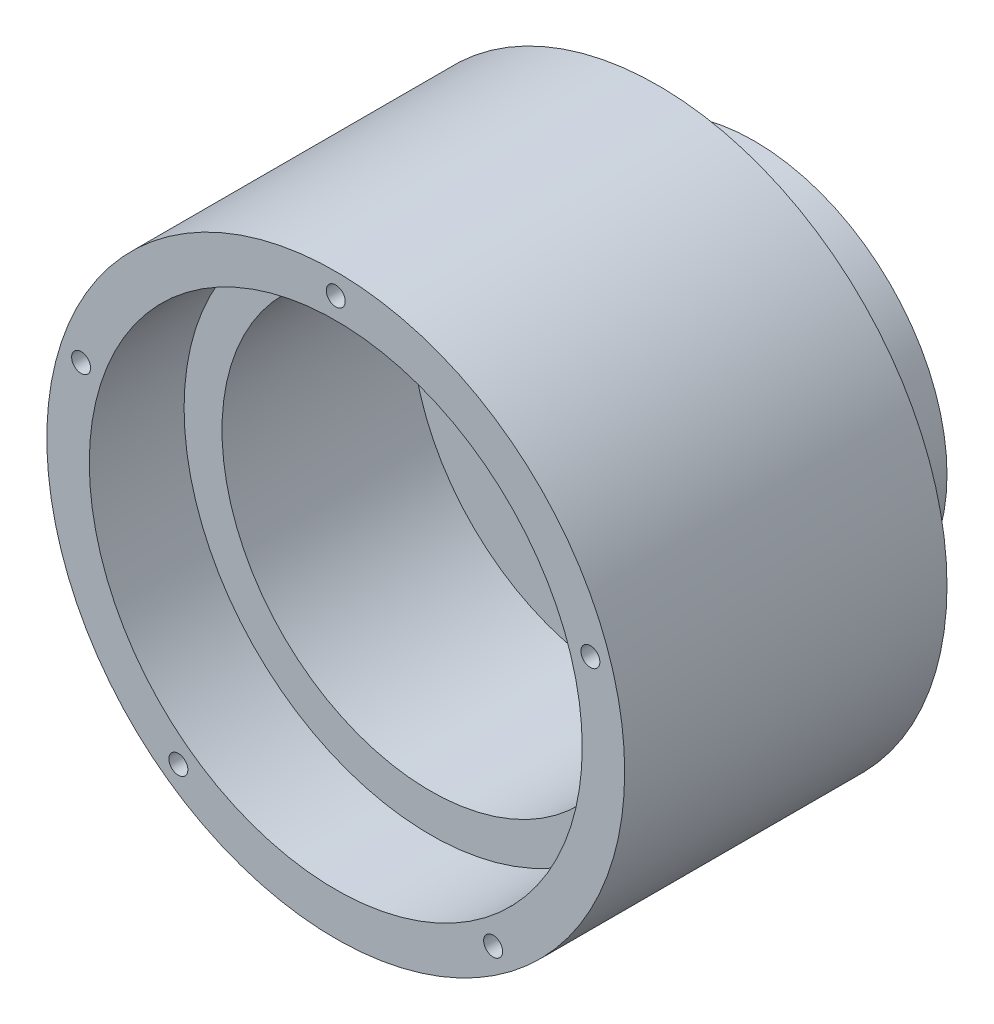
ISO-10303-21;
HEADER;
FILE_DESCRIPTION(('STEP AP214'),'2;1');
FILE_NAME('part.step','',(''),(''),'','','');
FILE_SCHEMA(('AUTOMOTIVE_DESIGN { 1 0 10303 214 1 1 1 1 }'));
ENDSEC;
DATA;
#1=APPLICATION_CONTEXT('core data for automotive mechanical design processes');
#2=APPLICATION_PROTOCOL_DEFINITION('international standard','automotive_design',2000,#1);
#3=PRODUCT_CONTEXT('',#1,'mechanical');
#4=PRODUCT('Part','Part','',(#3));
#5=PRODUCT_RELATED_PRODUCT_CATEGORY('part','',(#4));
#6=PRODUCT_DEFINITION_FORMATION('','',#4);
#7=PRODUCT_DEFINITION_CONTEXT('part definition',#1,'design');
#8=PRODUCT_DEFINITION('design','',#6,#7);
#9=PRODUCT_DEFINITION_SHAPE('','',#8);
#10=(LENGTH_UNIT() NAMED_UNIT(*) SI_UNIT(.MILLI.,.METRE.));
#11=(NAMED_UNIT(*) PLANE_ANGLE_UNIT() SI_UNIT($,.RADIAN.));
#12=(NAMED_UNIT(*) SI_UNIT($,.STERADIAN.) SOLID_ANGLE_UNIT());
#13=UNCERTAINTY_MEASURE_WITH_UNIT(LENGTH_MEASURE(1.E-05),#10,'distance_accuracy_value','');
#14=(GEOMETRIC_REPRESENTATION_CONTEXT(3) GLOBAL_UNCERTAINTY_ASSIGNED_CONTEXT((#13)) GLOBAL_UNIT_ASSIGNED_CONTEXT((#10,
#11,#12)) REPRESENTATION_CONTEXT('',''));
#15=CARTESIAN_POINT('',(0.,0.,0.));
#16=DIRECTION('',(0.,0.,1.));
#17=DIRECTION('',(1.,0.,0.));
#18=AXIS2_PLACEMENT_3D('',#15,#16,#17);
#19=CARTESIAN_POINT('',(0.,0.,85.));
#20=DIRECTION('',(0.,0.,-1.));
#21=DIRECTION('',(-1.,0.,0.));
#22=AXIS2_PLACEMENT_3D('',#19,#20,#21);
#23=CYLINDRICAL_SURFACE('',#22,76.2);
#24=CARTESIAN_POINT('',(0.,0.,85.));
#25=DIRECTION('',(0.,0.,1.));
#26=DIRECTION('',(1.,0.,0.));
#27=AXIS2_PLACEMENT_3D('',#24,#25,#26);
#28=CIRCLE('',#27,76.2);
#29=CARTESIAN_POINT('',(76.2,0.,85.));
#30=VERTEX_POINT('',#29);
#31=EDGE_CURVE('E52',#30,#30,#28,.T.);
#32=ORIENTED_EDGE('',*,*,#31,.F.);
#33=EDGE_LOOP('',(#32));
#34=FACE_BOUND('',#33,.T.);
#35=CARTESIAN_POINT('',(0.,0.,0.));
#36=DIRECTION('',(0.,0.,1.));
#37=DIRECTION('',(1.,0.,0.));
#38=AXIS2_PLACEMENT_3D('',#35,#36,#37);
#39=CIRCLE('',#38,76.2);
#40=CARTESIAN_POINT('',(76.2,0.,0.));
#41=VERTEX_POINT('',#40);
#42=EDGE_CURVE('E57',#41,#41,#39,.T.);
#43=ORIENTED_EDGE('',*,*,#42,.T.);
#44=EDGE_LOOP('',(#43));
#45=FACE_BOUND('',#44,.T.);
#46=ADVANCED_FACE('F45',(#34,#45),#23,.T.);
#47=CARTESIAN_POINT('',(0.,0.,85.));
#48=DIRECTION('',(0.,0.,1.));
#49=DIRECTION('',(1.,0.,0.));
#50=AXIS2_PLACEMENT_3D('',#47,#48,#49);
#51=PLANE('',#50);
#52=CARTESIAN_POINT('',(-67.1560027286335,21.8203080068036,85.));
#53=DIRECTION('',(0.,0.,1.));
#54=DIRECTION('',(0.309016994374945,0.951056516295155,0.));
#55=AXIS2_PLACEMENT_3D('',#52,#53,#54);
#56=CIRCLE('',#55,2.5);
#57=CARTESIAN_POINT('',(-66.3834602426961,24.1979492975415,85.));
#58=VERTEX_POINT('',#57);
#59=EDGE_CURVE('E67',#58,#58,#56,.T.);
#60=ORIENTED_EDGE('',*,*,#59,.F.);
#61=EDGE_LOOP('',(#60));
#62=FACE_BOUND('',#61,.T.);
#63=CARTESIAN_POINT('',(-41.5046922348758,-57.126308006804,85.));
#64=DIRECTION('',(0.,0.,1.));
#65=DIRECTION('',(-0.809016994374951,0.587785252292469,0.));
#66=AXIS2_PLACEMENT_3D('',#63,#64,#65);
#67=CIRCLE('',#66,2.5);
#68=CARTESIAN_POINT('',(-43.5272347208132,-55.6568448760729,85.));
#69=VERTEX_POINT('',#68);
#70=EDGE_CURVE('E73',#69,#69,#67,.T.);
#71=ORIENTED_EDGE('',*,*,#70,.F.);
#72=EDGE_LOOP('',(#71));
#73=FACE_BOUND('',#72,.T.);
#74=CARTESIAN_POINT('',(41.5046922348766,-57.1263080068034,85.));
#75=DIRECTION('',(0.,0.,1.));
#76=DIRECTION('',(-0.809016994374942,-0.58778525229248,0.));
#77=AXIS2_PLACEMENT_3D('',#74,#75,#76);
#78=CIRCLE('',#77,2.5);
#79=CARTESIAN_POINT('',(39.4821497489393,-58.5957711375346,85.));
#80=VERTEX_POINT('',#79);
#81=EDGE_CURVE('E79',#80,#80,#78,.T.);
#82=ORIENTED_EDGE('',*,*,#81,.F.);
#83=EDGE_LOOP('',(#82));
#84=FACE_BOUND('',#83,.T.);
#85=CARTESIAN_POINT('',(67.1560027286331,21.8203080068045,85.));
#86=DIRECTION('',(0.,0.,1.));
#87=DIRECTION('',(0.309016994374958,-0.95105651629515,0.));
#88=AXIS2_PLACEMENT_3D('',#85,#86,#87);
#89=CIRCLE('',#88,2.5);
#90=CARTESIAN_POINT('',(67.9285452145705,19.4426667160667,85.));
#91=VERTEX_POINT('',#90);
#92=EDGE_CURVE('E85',#91,#91,#89,.T.);
#93=ORIENTED_EDGE('',*,*,#92,.F.);
#94=EDGE_LOOP('',(#93));
#95=FACE_BOUND('',#94,.T.);
#96=CARTESIAN_POINT('',(0.,70.612,85.));
#97=DIRECTION('',(0.,0.,1.));
#98=DIRECTION('',(1.,0.,0.));
#99=AXIS2_PLACEMENT_3D('',#96,#97,#98);
#100=CIRCLE('',#99,2.5);
#101=CARTESIAN_POINT('',(2.5,70.612,85.));
#102=VERTEX_POINT('',#101);
#103=EDGE_CURVE('E66',#102,#102,#100,.T.);
#104=ORIENTED_EDGE('',*,*,#103,.F.);
#105=EDGE_LOOP('',(#104));
#106=FACE_BOUND('',#105,.T.);
#107=CARTESIAN_POINT('',(0.,0.,85.));
#108=DIRECTION('',(0.,0.,1.));
#109=DIRECTION('',(1.,0.,0.));
#110=AXIS2_PLACEMENT_3D('',#107,#108,#109);
#111=CIRCLE('',#110,65.);
#112=CARTESIAN_POINT('',(65.,0.,85.));
#113=VERTEX_POINT('',#112);
#114=EDGE_CURVE('E97',#113,#113,#111,.T.);
#115=ORIENTED_EDGE('',*,*,#114,.F.);
#116=EDGE_LOOP('',(#115));
#117=FACE_BOUND('',#116,.T.);
#118=ORIENTED_EDGE('',*,*,#31,.T.);
#119=EDGE_LOOP('',(#118));
#120=FACE_BOUND('',#119,.T.);
#121=ADVANCED_FACE('F159',(#62,#73,#84,#95,#106,#117,#120),#51,.T.);
#122=CARTESIAN_POINT('',(0.,0.,0.));
#123=DIRECTION('',(0.,0.,1.));
#124=DIRECTION('',(1.,0.,0.));
#125=AXIS2_PLACEMENT_3D('',#122,#123,#124);
#126=PLANE('',#125);
#127=CARTESIAN_POINT('',(66.4312976632166,-21.5848370570899,0.));
#128=DIRECTION('',(0.,0.,1.));
#129=DIRECTION('',(1.,0.,0.));
#130=AXIS2_PLACEMENT_3D('',#127,#128,#129);
#131=CIRCLE('',#130,2.54);
#132=CARTESIAN_POINT('',(68.9712976632165,-21.5848370570899,0.));
#133=VERTEX_POINT('',#132);
#134=EDGE_CURVE('E48',#133,#133,#131,.F.);
#135=ORIENTED_EDGE('',*,*,#134,.F.);
#136=EDGE_LOOP('',(#135));
#137=FACE_BOUND('',#136,.T.);
#138=CARTESIAN_POINT('',(41.0567998726289,56.5098370570903,0.));
#139=DIRECTION('',(0.,0.,1.));
#140=DIRECTION('',(1.,0.,0.));
#141=AXIS2_PLACEMENT_3D('',#138,#139,#140);
#142=CIRCLE('',#141,2.54);
#143=CARTESIAN_POINT('',(43.5967998726289,56.5098370570903,0.));
#144=VERTEX_POINT('',#143);
#145=EDGE_CURVE('E121',#144,#144,#142,.F.);
#146=ORIENTED_EDGE('',*,*,#145,.F.);
#147=EDGE_LOOP('',(#146));
#148=FACE_BOUND('',#147,.T.);
#149=CARTESIAN_POINT('',(-41.0567998726297,56.5098370570897,0.));
#150=DIRECTION('',(0.,0.,1.));
#151=DIRECTION('',(1.,0.,0.));
#152=AXIS2_PLACEMENT_3D('',#149,#150,#151);
#153=CIRCLE('',#152,2.54);
#154=CARTESIAN_POINT('',(-38.5167998726298,56.5098370570897,0.));
#155=VERTEX_POINT('',#154);
#156=EDGE_CURVE('E118',#155,#155,#153,.F.);
#157=ORIENTED_EDGE('',*,*,#156,.F.);
#158=EDGE_LOOP('',(#157));
#159=FACE_BOUND('',#158,.T.);
#160=CARTESIAN_POINT('',(-66.4312976632162,-21.5848370570908,0.));
#161=DIRECTION('',(0.,0.,1.));
#162=DIRECTION('',(1.,0.,0.));
#163=AXIS2_PLACEMENT_3D('',#160,#161,#162);
#164=CIRCLE('',#163,2.54);
#165=CARTESIAN_POINT('',(-63.8912976632162,-21.5848370570908,0.));
#166=VERTEX_POINT('',#165);
#167=EDGE_CURVE('E115',#166,#166,#164,.F.);
#168=ORIENTED_EDGE('',*,*,#167,.F.);
#169=EDGE_LOOP('',(#168));
#170=FACE_BOUND('',#169,.T.);
#171=CARTESIAN_POINT('',(0.,-69.85,0.));
#172=DIRECTION('',(0.,0.,1.));
#173=DIRECTION('',(1.,0.,0.));
#174=AXIS2_PLACEMENT_3D('',#171,#172,#173);
#175=CIRCLE('',#174,2.54);
#176=CARTESIAN_POINT('',(2.54,-69.85,0.));
#177=VERTEX_POINT('',#176);
#178=EDGE_CURVE('E111',#177,#177,#175,.F.);
#179=ORIENTED_EDGE('',*,*,#178,.F.);
#180=EDGE_LOOP('',(#179));
#181=FACE_BOUND('',#180,.T.);
#182=CARTESIAN_POINT('',(0.,0.,0.));
#183=DIRECTION('',(0.,0.,-1.));
#184=DIRECTION('',(-1.,0.,0.));
#185=AXIS2_PLACEMENT_3D('',#182,#183,#184);
#186=CIRCLE('',#185,50.8);
#187=CARTESIAN_POINT('',(50.8,0.,0.));
#188=VERTEX_POINT('',#187);
#189=EDGE_CURVE('E10',#188,#188,#186,.T.);
#190=ORIENTED_EDGE('',*,*,#189,.F.);
#191=EDGE_LOOP('',(#190));
#192=FACE_BOUND('',#191,.T.);
#193=ORIENTED_EDGE('',*,*,#42,.F.);
#194=EDGE_LOOP('',(#193));
#195=FACE_BOUND('',#194,.T.);
#196=ADVANCED_FACE('F164',(#137,#148,#159,#170,#181,#192,#195),#126,.F.);
#197=CARTESIAN_POINT('',(0.,0.,60.));
#198=DIRECTION('',(0.,0.,1.));
#199=DIRECTION('',(1.,0.,0.));
#200=AXIS2_PLACEMENT_3D('',#197,#198,#199);
#201=CYLINDRICAL_SURFACE('',#200,65.);
#202=CARTESIAN_POINT('',(0.,0.,60.));
#203=DIRECTION('',(0.,0.,1.));
#204=DIRECTION('',(1.,0.,0.));
#205=AXIS2_PLACEMENT_3D('',#202,#203,#204);
#206=CIRCLE('',#205,65.);
#207=CARTESIAN_POINT('',(65.,0.,60.));
#208=VERTEX_POINT('',#207);
#209=EDGE_CURVE('E100',#208,#208,#206,.T.);
#210=ORIENTED_EDGE('',*,*,#209,.F.);
#211=EDGE_LOOP('',(#210));
#212=FACE_BOUND('',#211,.T.);
#213=ORIENTED_EDGE('',*,*,#114,.T.);
#214=EDGE_LOOP('',(#213));
#215=FACE_BOUND('',#214,.T.);
#216=ADVANCED_FACE('F172',(#212,#215),#201,.F.);
#217=CARTESIAN_POINT('',(0.,0.,60.));
#218=DIRECTION('',(0.,0.,1.));
#219=DIRECTION('',(1.,0.,0.));
#220=AXIS2_PLACEMENT_3D('',#217,#218,#219);
#221=PLANE('',#220);
#222=CARTESIAN_POINT('',(0.,0.,60.));
#223=DIRECTION('',(0.,0.,1.));
#224=DIRECTION('',(1.,0.,0.));
#225=AXIS2_PLACEMENT_3D('',#222,#223,#224);
#226=CIRCLE('',#225,55.);
#227=CARTESIAN_POINT('',(55.,0.,60.));
#228=VERTEX_POINT('',#227);
#229=EDGE_CURVE('E91',#228,#228,#226,.T.);
#230=ORIENTED_EDGE('',*,*,#229,.F.);
#231=EDGE_LOOP('',(#230));
#232=FACE_BOUND('',#231,.T.);
#233=ORIENTED_EDGE('',*,*,#209,.T.);
#234=EDGE_LOOP('',(#233));
#235=FACE_BOUND('',#234,.T.);
#236=ADVANCED_FACE('F177',(#232,#235),#221,.T.);
#237=CARTESIAN_POINT('',(0.,0.,10.));
#238=DIRECTION('',(0.,0.,1.));
#239=DIRECTION('',(1.,0.,0.));
#240=AXIS2_PLACEMENT_3D('',#237,#238,#239);
#241=CYLINDRICAL_SURFACE('',#240,55.);
#242=CARTESIAN_POINT('',(0.,0.,10.));
#243=DIRECTION('',(0.,0.,1.));
#244=DIRECTION('',(1.,0.,0.));
#245=AXIS2_PLACEMENT_3D('',#242,#243,#244);
#246=CIRCLE('',#245,55.);
#247=CARTESIAN_POINT('',(55.,0.,10.));
#248=VERTEX_POINT('',#247);
#249=EDGE_CURVE('E94',#248,#248,#246,.T.);
#250=ORIENTED_EDGE('',*,*,#249,.F.);
#251=EDGE_LOOP('',(#250));
#252=FACE_BOUND('',#251,.T.);
#253=ORIENTED_EDGE('',*,*,#229,.T.);
#254=EDGE_LOOP('',(#253));
#255=FACE_BOUND('',#254,.T.);
#256=ADVANCED_FACE('F184',(#252,#255),#241,.F.);
#257=CARTESIAN_POINT('',(0.,0.,10.));
#258=DIRECTION('',(0.,0.,1.));
#259=DIRECTION('',(1.,0.,0.));
#260=AXIS2_PLACEMENT_3D('',#257,#258,#259);
#261=PLANE('',#260);
#262=CARTESIAN_POINT('',(0.,0.,9.99999999999999));
#263=DIRECTION('',(0.,0.,1.));
#264=DIRECTION('',(1.,0.,0.));
#265=AXIS2_PLACEMENT_3D('',#262,#263,#264);
#266=CIRCLE('',#265,38.1);
#267=CARTESIAN_POINT('',(-38.1,0.,9.99999999999998));
#268=VERTEX_POINT('',#267);
#269=EDGE_CURVE('E110',#268,#268,#266,.T.);
#270=ORIENTED_EDGE('',*,*,#269,.F.);
#271=EDGE_LOOP('',(#270));
#272=FACE_BOUND('',#271,.T.);
#273=ORIENTED_EDGE('',*,*,#249,.T.);
#274=EDGE_LOOP('',(#273));
#275=FACE_BOUND('',#274,.T.);
#276=ADVANCED_FACE('F188',(#272,#275),#261,.T.);
#277=CARTESIAN_POINT('',(0.,70.612,65.));
#278=DIRECTION('',(0.,0.,1.));
#279=DIRECTION('',(1.,0.,0.));
#280=AXIS2_PLACEMENT_3D('',#277,#278,#279);
#281=CYLINDRICAL_SURFACE('',#280,2.5);
#282=CARTESIAN_POINT('',(0.,70.612,65.));
#283=DIRECTION('',(0.,0.,1.));
#284=DIRECTION('',(1.,0.,0.));
#285=AXIS2_PLACEMENT_3D('',#282,#283,#284);
#286=CIRCLE('',#285,2.5);
#287=CARTESIAN_POINT('',(2.5,70.612,65.));
#288=VERTEX_POINT('',#287);
#289=EDGE_CURVE('E88',#288,#288,#286,.T.);
#290=ORIENTED_EDGE('',*,*,#289,.F.);
#291=EDGE_LOOP('',(#290));
#292=FACE_BOUND('',#291,.T.);
#293=ORIENTED_EDGE('',*,*,#103,.T.);
#294=EDGE_LOOP('',(#293));
#295=FACE_BOUND('',#294,.T.);
#296=ADVANCED_FACE('F192',(#292,#295),#281,.F.);
#297=CARTESIAN_POINT('',(0.,70.612,65.));
#298=DIRECTION('',(0.,0.,1.));
#299=DIRECTION('',(1.,0.,0.));
#300=AXIS2_PLACEMENT_3D('',#297,#298,#299);
#301=PLANE('',#300);
#302=ORIENTED_EDGE('',*,*,#289,.T.);
#303=EDGE_LOOP('',(#302));
#304=FACE_BOUND('',#303,.T.);
#305=ADVANCED_FACE('F196',(#304),#301,.T.);
#306=CARTESIAN_POINT('',(67.1560027286331,21.8203080068045,65.));
#307=DIRECTION('',(0.,0.,1.));
#308=DIRECTION('',(1.,0.,0.));
#309=AXIS2_PLACEMENT_3D('',#306,#307,#308);
#310=CYLINDRICAL_SURFACE('',#309,2.5);
#311=CARTESIAN_POINT('',(67.1560027286331,21.8203080068045,65.));
#312=DIRECTION('',(0.,0.,1.));
#313=DIRECTION('',(0.309016994374958,-0.95105651629515,0.));
#314=AXIS2_PLACEMENT_3D('',#311,#312,#313);
#315=CIRCLE('',#314,2.5);
#316=CARTESIAN_POINT('',(67.9285452145705,19.4426667160667,65.));
#317=VERTEX_POINT('',#316);
#318=EDGE_CURVE('E82',#317,#317,#315,.T.);
#319=ORIENTED_EDGE('',*,*,#318,.F.);
#320=EDGE_LOOP('',(#319));
#321=FACE_BOUND('',#320,.T.);
#322=ORIENTED_EDGE('',*,*,#92,.T.);
#323=EDGE_LOOP('',(#322));
#324=FACE_BOUND('',#323,.T.);
#325=ADVANCED_FACE('F200',(#321,#324),#310,.F.);
#326=CARTESIAN_POINT('',(67.1560027286331,21.8203080068045,65.));
#327=DIRECTION('',(0.,0.,1.));
#328=DIRECTION('',(0.309016994374958,-0.95105651629515,0.));
#329=AXIS2_PLACEMENT_3D('',#326,#327,#328);
#330=PLANE('',#329);
#331=ORIENTED_EDGE('',*,*,#318,.T.);
#332=EDGE_LOOP('',(#331));
#333=FACE_BOUND('',#332,.T.);
#334=ADVANCED_FACE('F204',(#333),#330,.T.);
#335=CARTESIAN_POINT('',(41.5046922348766,-57.1263080068034,65.));
#336=DIRECTION('',(0.,0.,1.));
#337=DIRECTION('',(1.,0.,0.));
#338=AXIS2_PLACEMENT_3D('',#335,#336,#337);
#339=CYLINDRICAL_SURFACE('',#338,2.5);
#340=CARTESIAN_POINT('',(41.5046922348766,-57.1263080068034,65.));
#341=DIRECTION('',(0.,0.,1.));
#342=DIRECTION('',(-0.809016994374942,-0.58778525229248,0.));
#343=AXIS2_PLACEMENT_3D('',#340,#341,#342);
#344=CIRCLE('',#343,2.5);
#345=CARTESIAN_POINT('',(39.4821497489393,-58.5957711375346,65.));
#346=VERTEX_POINT('',#345);
#347=EDGE_CURVE('E76',#346,#346,#344,.T.);
#348=ORIENTED_EDGE('',*,*,#347,.F.);
#349=EDGE_LOOP('',(#348));
#350=FACE_BOUND('',#349,.T.);
#351=ORIENTED_EDGE('',*,*,#81,.T.);
#352=EDGE_LOOP('',(#351));
#353=FACE_BOUND('',#352,.T.);
#354=ADVANCED_FACE('F208',(#350,#353),#339,.F.);
#355=CARTESIAN_POINT('',(41.5046922348766,-57.1263080068034,65.));
#356=DIRECTION('',(0.,0.,1.));
#357=DIRECTION('',(-0.809016994374942,-0.58778525229248,0.));
#358=AXIS2_PLACEMENT_3D('',#355,#356,#357);
#359=PLANE('',#358);
#360=ORIENTED_EDGE('',*,*,#347,.T.);
#361=EDGE_LOOP('',(#360));
#362=FACE_BOUND('',#361,.T.);
#363=ADVANCED_FACE('F212',(#362),#359,.T.);
#364=CARTESIAN_POINT('',(-41.5046922348758,-57.126308006804,65.));
#365=DIRECTION('',(0.,0.,1.));
#366=DIRECTION('',(1.,0.,0.));
#367=AXIS2_PLACEMENT_3D('',#364,#365,#366);
#368=CYLINDRICAL_SURFACE('',#367,2.5);
#369=CARTESIAN_POINT('',(-41.5046922348758,-57.126308006804,65.));
#370=DIRECTION('',(0.,0.,1.));
#371=DIRECTION('',(-0.809016994374951,0.587785252292469,0.));
#372=AXIS2_PLACEMENT_3D('',#369,#370,#371);
#373=CIRCLE('',#372,2.5);
#374=CARTESIAN_POINT('',(-43.5272347208132,-55.6568448760729,65.));
#375=VERTEX_POINT('',#374);
#376=EDGE_CURVE('E70',#375,#375,#373,.T.);
#377=ORIENTED_EDGE('',*,*,#376,.F.);
#378=EDGE_LOOP('',(#377));
#379=FACE_BOUND('',#378,.T.);
#380=ORIENTED_EDGE('',*,*,#70,.T.);
#381=EDGE_LOOP('',(#380));
#382=FACE_BOUND('',#381,.T.);
#383=ADVANCED_FACE('F216',(#379,#382),#368,.F.);
#384=CARTESIAN_POINT('',(-41.5046922348758,-57.126308006804,65.));
#385=DIRECTION('',(0.,0.,1.));
#386=DIRECTION('',(-0.809016994374951,0.587785252292469,0.));
#387=AXIS2_PLACEMENT_3D('',#384,#385,#386);
#388=PLANE('',#387);
#389=ORIENTED_EDGE('',*,*,#376,.T.);
#390=EDGE_LOOP('',(#389));
#391=FACE_BOUND('',#390,.T.);
#392=ADVANCED_FACE('F220',(#391),#388,.T.);
#393=CARTESIAN_POINT('',(-67.1560027286335,21.8203080068036,65.));
#394=DIRECTION('',(0.,0.,1.));
#395=DIRECTION('',(1.,0.,0.));
#396=AXIS2_PLACEMENT_3D('',#393,#394,#395);
#397=CYLINDRICAL_SURFACE('',#396,2.5);
#398=CARTESIAN_POINT('',(-67.1560027286335,21.8203080068036,65.));
#399=DIRECTION('',(0.,0.,1.));
#400=DIRECTION('',(0.309016994374945,0.951056516295155,0.));
#401=AXIS2_PLACEMENT_3D('',#398,#399,#400);
#402=CIRCLE('',#401,2.5);
#403=CARTESIAN_POINT('',(-66.3834602426961,24.1979492975415,65.));
#404=VERTEX_POINT('',#403);
#405=EDGE_CURVE('E63',#404,#404,#402,.T.);
#406=ORIENTED_EDGE('',*,*,#405,.F.);
#407=EDGE_LOOP('',(#406));
#408=FACE_BOUND('',#407,.T.);
#409=ORIENTED_EDGE('',*,*,#59,.T.);
#410=EDGE_LOOP('',(#409));
#411=FACE_BOUND('',#410,.T.);
#412=ADVANCED_FACE('F155',(#408,#411),#397,.F.);
#413=CARTESIAN_POINT('',(-67.1560027286335,21.8203080068036,65.));
#414=DIRECTION('',(0.,0.,1.));
#415=DIRECTION('',(0.309016994374945,0.951056516295155,0.));
#416=AXIS2_PLACEMENT_3D('',#413,#414,#415);
#417=PLANE('',#416);
#418=ORIENTED_EDGE('',*,*,#405,.T.);
#419=EDGE_LOOP('',(#418));
#420=FACE_BOUND('',#419,.T.);
#421=ADVANCED_FACE('F145',(#420),#417,.T.);
#422=CARTESIAN_POINT('',(0.,0.,-25.4));
#423=DIRECTION('',(0.,0.,1.));
#424=DIRECTION('',(1.,0.,0.));
#425=AXIS2_PLACEMENT_3D('',#422,#423,#424);
#426=CYLINDRICAL_SURFACE('',#425,50.8);
#427=CARTESIAN_POINT('',(0.,0.,-25.4));
#428=DIRECTION('',(0.,0.,-1.));
#429=DIRECTION('',(-1.,0.,0.));
#430=AXIS2_PLACEMENT_3D('',#427,#428,#429);
#431=CIRCLE('',#430,50.8);
#432=CARTESIAN_POINT('',(50.8,0.,-25.4));
#433=VERTEX_POINT('',#432);
#434=EDGE_CURVE('E61',#433,#433,#431,.T.);
#435=CARTESIAN_POINT('',(50.8,0.,-25.4));
#436=CARTESIAN_POINT('',(50.8,0.,-25.1354166666667));
#437=CARTESIAN_POINT('',(50.8,0.,-24.8708333333333));
#438=CARTESIAN_POINT('',(50.8,0.,-24.3416666666667));
#439=CARTESIAN_POINT('',(50.8,0.,-24.0770833333333));
#440=CARTESIAN_POINT('',(50.8,0.,-23.5479166666667));
#441=CARTESIAN_POINT('',(50.8,0.,-23.2833333333333));
#442=CARTESIAN_POINT('',(50.8,0.,-22.7541666666667));
#443=CARTESIAN_POINT('',(50.8,0.,-22.4895833333333));
#444=CARTESIAN_POINT('',(50.8,0.,-21.9604166666667));
#445=CARTESIAN_POINT('',(50.8,0.,-21.6958333333333));
#446=CARTESIAN_POINT('',(50.8,0.,-21.1666666666667));
#447=CARTESIAN_POINT('',(50.8,0.,-20.9020833333333));
#448=CARTESIAN_POINT('',(50.8,0.,-20.3729166666667));
#449=CARTESIAN_POINT('',(50.8,0.,-20.1083333333333));
#450=CARTESIAN_POINT('',(50.8,0.,-19.5791666666667));
#451=CARTESIAN_POINT('',(50.8,0.,-19.3145833333333));
#452=CARTESIAN_POINT('',(50.8,0.,-18.7854166666667));
#453=CARTESIAN_POINT('',(50.8,0.,-18.5208333333333));
#454=CARTESIAN_POINT('',(50.8,0.,-17.9916666666667));
#455=CARTESIAN_POINT('',(50.8,0.,-17.7270833333333));
#456=CARTESIAN_POINT('',(50.8,0.,-17.1979166666667));
#457=CARTESIAN_POINT('',(50.8,0.,-16.9333333333333));
#458=CARTESIAN_POINT('',(50.8,0.,-16.4041666666667));
#459=CARTESIAN_POINT('',(50.8,0.,-16.1395833333333));
#460=CARTESIAN_POINT('',(50.8,0.,-15.6104166666667));
#461=CARTESIAN_POINT('',(50.8,0.,-15.3458333333333));
#462=CARTESIAN_POINT('',(50.8,0.,-14.8166666666667));
#463=CARTESIAN_POINT('',(50.8,0.,-14.5520833333333));
#464=CARTESIAN_POINT('',(50.8,0.,-14.0229166666667));
#465=CARTESIAN_POINT('',(50.8,0.,-13.7583333333333));
#466=CARTESIAN_POINT('',(50.8,0.,-13.2291666666667));
#467=CARTESIAN_POINT('',(50.8,0.,-12.9645833333333));
#468=CARTESIAN_POINT('',(50.8,0.,-12.4354166666667));
#469=CARTESIAN_POINT('',(50.8,0.,-12.1708333333333));
#470=CARTESIAN_POINT('',(50.8,0.,-11.6416666666667));
#471=CARTESIAN_POINT('',(50.8,0.,-11.3770833333333));
#472=CARTESIAN_POINT('',(50.8,0.,-10.8479166666667));
#473=CARTESIAN_POINT('',(50.8,0.,-10.5833333333333));
#474=CARTESIAN_POINT('',(50.8,0.,-10.0541666666667));
#475=CARTESIAN_POINT('',(50.8,0.,-9.78958333333334));
#476=CARTESIAN_POINT('',(50.8,0.,-9.26041666666667));
#477=CARTESIAN_POINT('',(50.8,0.,-8.99583333333333));
#478=CARTESIAN_POINT('',(50.8,0.,-8.46666666666667));
#479=CARTESIAN_POINT('',(50.8,0.,-8.20208333333333));
#480=CARTESIAN_POINT('',(50.8,0.,-7.67291666666667));
#481=CARTESIAN_POINT('',(50.8,0.,-7.40833333333333));
#482=CARTESIAN_POINT('',(50.8,0.,-6.87916666666667));
#483=CARTESIAN_POINT('',(50.8,0.,-6.61458333333333));
#484=CARTESIAN_POINT('',(50.8,0.,-6.08541666666667));
#485=CARTESIAN_POINT('',(50.8,0.,-5.82083333333333));
#486=CARTESIAN_POINT('',(50.8,0.,-5.29166666666667));
#487=CARTESIAN_POINT('',(50.8,0.,-5.02708333333333));
#488=CARTESIAN_POINT('',(50.8,0.,-4.49791666666667));
#489=CARTESIAN_POINT('',(50.8,0.,-4.23333333333333));
#490=CARTESIAN_POINT('',(50.8,0.,-3.70416666666667));
#491=CARTESIAN_POINT('',(50.8,0.,-3.43958333333333));
#492=CARTESIAN_POINT('',(50.8,0.,-2.91041666666667));
#493=CARTESIAN_POINT('',(50.8,0.,-2.64583333333333));
#494=CARTESIAN_POINT('',(50.8,0.,-2.11666666666667));
#495=CARTESIAN_POINT('',(50.8,0.,-1.85208333333333));
#496=CARTESIAN_POINT('',(50.8,0.,-1.32291666666667));
#497=CARTESIAN_POINT('',(50.8,0.,-1.05833333333333));
#498=CARTESIAN_POINT('',(50.8,0.,-0.529166666666666));
#499=CARTESIAN_POINT('',(50.8,0.,-0.264583333333333));
#500=CARTESIAN_POINT('',(50.8,0.,0.));
#501=B_SPLINE_CURVE_WITH_KNOTS('',3,(#435,#436,#437,#438,#439,#440,#441,#442,#443,#444,#445,
#446,#447,#448,#449,#450,#451,#452,#453,#454,#455,#456,#457,#458,#459,#460,#461,#462,#463,#464,
#465,#466,#467,#468,#469,#470,#471,#472,#473,#474,#475,#476,#477,#478,#479,#480,#481,#482,#483,
#484,#485,#486,#487,#488,#489,#490,#491,#492,#493,#494,#495,#496,#497,#498,#499,#500),
.UNSPECIFIED.,.F.,.F.,(4,2,2,2,2,2,2,2,2,2,2,2,2,2,2,2,2,2,2,2,2,2,2,2,2,2,2,2,2,2,2,2,4),(0.,
0.793749999999999,1.5875,2.38125,3.175,3.96875,4.7625,5.55625,6.35,7.14375,7.9375,8.73125,9.525,
10.31875,11.1125,11.90625,12.7,13.49375,14.2875,15.08125,15.875,16.66875,17.4625,18.25625,19.05,
19.84375,20.6375,21.43125,22.225,23.01875,23.8125,24.60625,25.4),.UNSPECIFIED.);
#502=EDGE_CURVE('BSEAM143',#433,#188,#501,.T.);
#503=ORIENTED_EDGE('',*,*,#434,.F.);
#504=ORIENTED_EDGE('',*,*,#189,.T.);
#505=ORIENTED_EDGE('',*,*,#502,.T.);
#506=ORIENTED_EDGE('',*,*,#502,.F.);
#507=EDGE_LOOP('',(#503,#505,#504,#506));
#508=FACE_BOUND('',#507,.T.);
#509=ADVANCED_FACE('F143',(#508),#426,.T.);
#510=CARTESIAN_POINT('',(0.,0.,-25.4));
#511=DIRECTION('',(0.,0.,-1.));
#512=DIRECTION('',(-1.,0.,0.));
#513=AXIS2_PLACEMENT_3D('',#510,#511,#512);
#514=PLANE('',#513);
#515=CARTESIAN_POINT('',(0.,0.,-25.4));
#516=DIRECTION('',(0.,0.,-1.));
#517=DIRECTION('',(-1.,0.,0.));
#518=AXIS2_PLACEMENT_3D('',#515,#516,#517);
#519=CIRCLE('',#518,38.1);
#520=CARTESIAN_POINT('',(-38.1,0.,-25.4));
#521=VERTEX_POINT('',#520);
#522=EDGE_CURVE('E107',#521,#521,#519,.T.);
#523=ORIENTED_EDGE('',*,*,#522,.F.);
#524=EDGE_LOOP('',(#523));
#525=FACE_BOUND('',#524,.T.);
#526=ORIENTED_EDGE('',*,*,#434,.T.);
#527=EDGE_LOOP('',(#526));
#528=FACE_BOUND('',#527,.T.);
#529=ADVANCED_FACE('F141',(#525,#528),#514,.T.);
#530=CARTESIAN_POINT('',(0.,0.,85.));
#531=DIRECTION('',(0.,0.,-1.));
#532=DIRECTION('',(-1.,0.,0.));
#533=AXIS2_PLACEMENT_3D('',#530,#531,#532);
#534=CYLINDRICAL_SURFACE('',#533,38.1);
#535=CARTESIAN_POINT('',(-38.1,0.,9.99999999999998));
#536=CARTESIAN_POINT('',(-38.1,0.,9.63124999999998));
#537=CARTESIAN_POINT('',(-38.1,0.,9.26249999999998));
#538=CARTESIAN_POINT('',(-38.1,0.,8.52499999999998));
#539=CARTESIAN_POINT('',(-38.1,0.,8.15624999999998));
#540=CARTESIAN_POINT('',(-38.1,0.,7.41874999999998));
#541=CARTESIAN_POINT('',(-38.1,0.,7.04999999999998));
#542=CARTESIAN_POINT('',(-38.1,0.,6.31249999999998));
#543=CARTESIAN_POINT('',(-38.1,0.,5.94374999999998));
#544=CARTESIAN_POINT('',(-38.1,0.,5.20624999999998));
#545=CARTESIAN_POINT('',(-38.1,0.,4.83749999999998));
#546=CARTESIAN_POINT('',(-38.1,0.,4.09999999999998));
#547=CARTESIAN_POINT('',(-38.1,0.,3.73124999999999));
#548=CARTESIAN_POINT('',(-38.1,0.,2.99374999999999));
#549=CARTESIAN_POINT('',(-38.1,0.,2.62499999999999));
#550=CARTESIAN_POINT('',(-38.1,0.,1.88749999999999));
#551=CARTESIAN_POINT('',(-38.1,0.,1.51874999999999));
#552=CARTESIAN_POINT('',(-38.1,0.,0.781249999999983));
#553=CARTESIAN_POINT('',(-38.1,0.,0.412499999999982));
#554=CARTESIAN_POINT('',(-38.1,0.,-0.32500000000002));
#555=CARTESIAN_POINT('',(-38.1,0.,-0.693750000000021));
#556=CARTESIAN_POINT('',(-38.1,0.,-1.43125000000002));
#557=CARTESIAN_POINT('',(-38.1,0.,-1.80000000000001));
#558=CARTESIAN_POINT('',(-38.1,0.,-2.53750000000001));
#559=CARTESIAN_POINT('',(-38.1,0.,-2.90625000000001));
#560=CARTESIAN_POINT('',(-38.1,0.,-3.64375000000001));
#561=CARTESIAN_POINT('',(-38.1,0.,-4.01250000000002));
#562=CARTESIAN_POINT('',(-38.1,0.,-4.75000000000001));
#563=CARTESIAN_POINT('',(-38.1,0.,-5.11875000000001));
#564=CARTESIAN_POINT('',(-38.1,0.,-5.85625000000001));
#565=CARTESIAN_POINT('',(-38.1,0.,-6.22500000000001));
#566=CARTESIAN_POINT('',(-38.1,0.,-6.96250000000001));
#567=CARTESIAN_POINT('',(-38.1,0.,-7.33125000000001));
#568=CARTESIAN_POINT('',(-38.1,0.,-8.06875000000001));
#569=CARTESIAN_POINT('',(-38.1,0.,-8.43750000000001));
#570=CARTESIAN_POINT('',(-38.1,0.,-9.17500000000002));
#571=CARTESIAN_POINT('',(-38.1,0.,-9.54375000000002));
#572=CARTESIAN_POINT('',(-38.1,0.,-10.28125));
#573=CARTESIAN_POINT('',(-38.1,0.,-10.65));
#574=CARTESIAN_POINT('',(-38.1,0.,-11.3875));
#575=CARTESIAN_POINT('',(-38.1,0.,-11.75625));
#576=CARTESIAN_POINT('',(-38.1,0.,-12.49375));
#577=CARTESIAN_POINT('',(-38.1,0.,-12.8625));
#578=CARTESIAN_POINT('',(-38.1,0.,-13.6));
#579=CARTESIAN_POINT('',(-38.1,0.,-13.96875));
#580=CARTESIAN_POINT('',(-38.1,0.,-14.70625));
#581=CARTESIAN_POINT('',(-38.1,0.,-15.075));
#582=CARTESIAN_POINT('',(-38.1,0.,-15.8125));
#583=CARTESIAN_POINT('',(-38.1,0.,-16.18125));
#584=CARTESIAN_POINT('',(-38.1,0.,-16.91875));
#585=CARTESIAN_POINT('',(-38.1,0.,-17.2875));
#586=CARTESIAN_POINT('',(-38.1,0.,-18.025));
#587=CARTESIAN_POINT('',(-38.1,0.,-18.39375));
#588=CARTESIAN_POINT('',(-38.1,0.,-19.13125));
#589=CARTESIAN_POINT('',(-38.1,0.,-19.5));
#590=CARTESIAN_POINT('',(-38.1,0.,-20.2375));
#591=CARTESIAN_POINT('',(-38.1,0.,-20.60625));
#592=CARTESIAN_POINT('',(-38.1,0.,-21.34375));
#593=CARTESIAN_POINT('',(-38.1,0.,-21.7125));
#594=CARTESIAN_POINT('',(-38.1,0.,-22.45));
#595=CARTESIAN_POINT('',(-38.1,0.,-22.81875));
#596=CARTESIAN_POINT('',(-38.1,0.,-23.55625));
#597=CARTESIAN_POINT('',(-38.1,0.,-23.925));
#598=CARTESIAN_POINT('',(-38.1,0.,-24.6625));
#599=CARTESIAN_POINT('',(-38.1,0.,-25.03125));
#600=CARTESIAN_POINT('',(-38.1,0.,-25.4));
#601=B_SPLINE_CURVE_WITH_KNOTS('',3,(#535,#536,#537,#538,#539,#540,#541,#542,#543,#544,#545,
#546,#547,#548,#549,#550,#551,#552,#553,#554,#555,#556,#557,#558,#559,#560,#561,#562,#563,#564,
#565,#566,#567,#568,#569,#570,#571,#572,#573,#574,#575,#576,#577,#578,#579,#580,#581,#582,#583,
#584,#585,#586,#587,#588,#589,#590,#591,#592,#593,#594,#595,#596,#597,#598,#599,#600),
.UNSPECIFIED.,.F.,.F.,(4,2,2,2,2,2,2,2,2,2,2,2,2,2,2,2,2,2,2,2,2,2,2,2,2,2,2,2,2,2,2,2,4),(0.,
1.10625,2.21250000000001,3.31875,4.425,5.53125,6.63749999999999,7.74374999999999,8.85,9.95625,
11.0625,12.16875,13.275,14.38125,15.4875,16.59375,17.7,18.80625,19.9125,21.01875,22.125,
23.23125,24.3375,25.44375,26.55,27.65625,28.7625,29.86875,30.975,32.08125,33.1875,34.29375,
35.4),.UNSPECIFIED.);
#602=EDGE_CURVE('BSEAM152',#268,#521,#601,.T.);
#603=ORIENTED_EDGE('',*,*,#269,.T.);
#604=ORIENTED_EDGE('',*,*,#522,.T.);
#605=ORIENTED_EDGE('',*,*,#602,.T.);
#606=ORIENTED_EDGE('',*,*,#602,.F.);
#607=EDGE_LOOP('',(#603,#605,#604,#606));
#608=FACE_BOUND('',#607,.T.);
#609=ADVANCED_FACE('F152',(#608),#534,.F.);
#610=CARTESIAN_POINT('',(0.,-69.85,-25.4));
#611=DIRECTION('',(0.,0.,1.));
#612=DIRECTION('',(1.,0.,0.));
#613=AXIS2_PLACEMENT_3D('',#610,#611,#612);
#614=CYLINDRICAL_SURFACE('',#613,2.54);
#615=CARTESIAN_POINT('',(0.,-69.85,25.4));
#616=DIRECTION('',(0.,0.,-1.));
#617=DIRECTION('',(-1.,0.,0.));
#618=AXIS2_PLACEMENT_3D('',#615,#616,#617);
#619=CIRCLE('',#618,2.54);
#620=CARTESIAN_POINT('',(-2.54,-69.85,25.4));
#621=VERTEX_POINT('',#620);
#622=EDGE_CURVE('E114',#621,#621,#619,.T.);
#623=ORIENTED_EDGE('',*,*,#622,.F.);
#624=EDGE_LOOP('',(#623));
#625=FACE_BOUND('',#624,.T.);
#626=ORIENTED_EDGE('',*,*,#178,.T.);
#627=EDGE_LOOP('',(#626));
#628=FACE_BOUND('',#627,.T.);
#629=ADVANCED_FACE('F275',(#625,#628),#614,.F.);
#630=CARTESIAN_POINT('',(0.,-69.85,25.4));
#631=DIRECTION('',(0.,0.,-1.));
#632=DIRECTION('',(-1.,0.,0.));
#633=AXIS2_PLACEMENT_3D('',#630,#631,#632);
#634=PLANE('',#633);
#635=ORIENTED_EDGE('',*,*,#622,.T.);
#636=EDGE_LOOP('',(#635));
#637=FACE_BOUND('',#636,.T.);
#638=ADVANCED_FACE('F284',(#637),#634,.T.);
#639=CARTESIAN_POINT('',(-66.4312976632162,-21.5848370570908,-25.4));
#640=DIRECTION('',(0.,0.,1.));
#641=DIRECTION('',(1.,0.,0.));
#642=AXIS2_PLACEMENT_3D('',#639,#640,#641);
#643=CYLINDRICAL_SURFACE('',#642,2.54);
#644=CARTESIAN_POINT('',(-66.4312976632162,-21.5848370570908,25.4));
#645=DIRECTION('',(0.,0.,-1.));
#646=DIRECTION('',(-0.309016994374958,0.95105651629515,0.));
#647=AXIS2_PLACEMENT_3D('',#644,#645,#646);
#648=CIRCLE('',#647,2.54);
#649=CARTESIAN_POINT('',(-67.2162008289286,-19.1691535057012,25.4));
#650=VERTEX_POINT('',#649);
#651=EDGE_CURVE('E133',#650,#650,#648,.T.);
#652=ORIENTED_EDGE('',*,*,#651,.F.);
#653=EDGE_LOOP('',(#652));
#654=FACE_BOUND('',#653,.T.);
#655=ORIENTED_EDGE('',*,*,#167,.T.);
#656=EDGE_LOOP('',(#655));
#657=FACE_BOUND('',#656,.T.);
#658=ADVANCED_FACE('F294',(#654,#657),#643,.F.);
#659=CARTESIAN_POINT('',(-66.4312976632162,-21.5848370570908,25.4));
#660=DIRECTION('',(0.,0.,-1.));
#661=DIRECTION('',(-0.309016994374958,0.95105651629515,0.));
#662=AXIS2_PLACEMENT_3D('',#659,#660,#661);
#663=PLANE('',#662);
#664=ORIENTED_EDGE('',*,*,#651,.T.);
#665=EDGE_LOOP('',(#664));
#666=FACE_BOUND('',#665,.T.);
#667=ADVANCED_FACE('F304',(#666),#663,.T.);
#668=CARTESIAN_POINT('',(-41.0567998726297,56.5098370570897,-25.4));
#669=DIRECTION('',(0.,0.,1.));
#670=DIRECTION('',(1.,0.,0.));
#671=AXIS2_PLACEMENT_3D('',#668,#669,#670);
#672=CYLINDRICAL_SURFACE('',#671,2.54);
#673=CARTESIAN_POINT('',(-41.0567998726297,56.5098370570897,25.4));
#674=DIRECTION('',(0.,0.,-1.));
#675=DIRECTION('',(0.809016994374942,0.58778525229248,0.));
#676=AXIS2_PLACEMENT_3D('',#673,#674,#675);
#677=CIRCLE('',#676,2.54);
#678=CARTESIAN_POINT('',(-39.0018967069174,58.0028115979126,25.4));
#679=VERTEX_POINT('',#678);
#680=EDGE_CURVE('E382',#679,#679,#677,.T.);
#681=ORIENTED_EDGE('',*,*,#680,.F.);
#682=EDGE_LOOP('',(#681));
#683=FACE_BOUND('',#682,.T.);
#684=ORIENTED_EDGE('',*,*,#156,.T.);
#685=EDGE_LOOP('',(#684));
#686=FACE_BOUND('',#685,.T.);
#687=ADVANCED_FACE('F314',(#683,#686),#672,.F.);
#688=CARTESIAN_POINT('',(-41.0567998726297,56.5098370570897,25.4));
#689=DIRECTION('',(0.,0.,-1.));
#690=DIRECTION('',(0.809016994374942,0.58778525229248,0.));
#691=AXIS2_PLACEMENT_3D('',#688,#689,#690);
#692=PLANE('',#691);
#693=ORIENTED_EDGE('',*,*,#680,.T.);
#694=EDGE_LOOP('',(#693));
#695=FACE_BOUND('',#694,.T.);
#696=ADVANCED_FACE('F324',(#695),#692,.T.);
#697=CARTESIAN_POINT('',(41.0567998726289,56.5098370570903,-25.4));
#698=DIRECTION('',(0.,0.,1.));
#699=DIRECTION('',(1.,0.,0.));
#700=AXIS2_PLACEMENT_3D('',#697,#698,#699);
#701=CYLINDRICAL_SURFACE('',#700,2.54);
#702=CARTESIAN_POINT('',(41.0567998726289,56.5098370570903,25.4));
#703=DIRECTION('',(0.,0.,-1.));
#704=DIRECTION('',(0.809016994374951,-0.587785252292469,0.));
#705=AXIS2_PLACEMENT_3D('',#702,#703,#704);
#706=CIRCLE('',#705,2.54);
#707=CARTESIAN_POINT('',(43.1117030383413,55.0168625162674,25.4));
#708=VERTEX_POINT('',#707);
#709=EDGE_CURVE('E379',#708,#708,#706,.T.);
#710=ORIENTED_EDGE('',*,*,#709,.F.);
#711=EDGE_LOOP('',(#710));
#712=FACE_BOUND('',#711,.T.);
#713=ORIENTED_EDGE('',*,*,#145,.T.);
#714=EDGE_LOOP('',(#713));
#715=FACE_BOUND('',#714,.T.);
#716=ADVANCED_FACE('F334',(#712,#715),#701,.F.);
#717=CARTESIAN_POINT('',(41.0567998726289,56.5098370570903,25.4));
#718=DIRECTION('',(0.,0.,-1.));
#719=DIRECTION('',(0.809016994374951,-0.587785252292469,0.));
#720=AXIS2_PLACEMENT_3D('',#717,#718,#719);
#721=PLANE('',#720);
#722=ORIENTED_EDGE('',*,*,#709,.T.);
#723=EDGE_LOOP('',(#722));
#724=FACE_BOUND('',#723,.T.);
#725=ADVANCED_FACE('F344',(#724),#721,.T.);
#726=CARTESIAN_POINT('',(66.4312976632166,-21.5848370570899,-25.4));
#727=DIRECTION('',(0.,0.,1.));
#728=DIRECTION('',(1.,0.,0.));
#729=AXIS2_PLACEMENT_3D('',#726,#727,#728);
#730=CYLINDRICAL_SURFACE('',#729,2.54);
#731=CARTESIAN_POINT('',(66.4312976632166,-21.5848370570899,25.4));
#732=DIRECTION('',(0.,0.,-1.));
#733=DIRECTION('',(-0.309016994374945,-0.951056516295155,0.));
#734=AXIS2_PLACEMENT_3D('',#731,#732,#733);
#735=CIRCLE('',#734,2.54);
#736=CARTESIAN_POINT('',(65.6463944975042,-24.0005206084796,25.4));
#737=VERTEX_POINT('',#736);
#738=EDGE_CURVE('E119',#737,#737,#735,.T.);
#739=ORIENTED_EDGE('',*,*,#738,.F.);
#740=EDGE_LOOP('',(#739));
#741=FACE_BOUND('',#740,.T.);
#742=ORIENTED_EDGE('',*,*,#134,.T.);
#743=EDGE_LOOP('',(#742));
#744=FACE_BOUND('',#743,.T.);
#745=ADVANCED_FACE('F354',(#741,#744),#730,.F.);
#746=CARTESIAN_POINT('',(66.4312976632166,-21.5848370570899,25.4));
#747=DIRECTION('',(0.,0.,-1.));
#748=DIRECTION('',(-0.309016994374945,-0.951056516295155,0.));
#749=AXIS2_PLACEMENT_3D('',#746,#747,#748);
#750=PLANE('',#749);
#751=ORIENTED_EDGE('',*,*,#738,.T.);
#752=EDGE_LOOP('',(#751));
#753=FACE_BOUND('',#752,.T.);
#754=ADVANCED_FACE('F364',(#753),#750,.T.);
#755=CLOSED_SHELL('',(#46,#121,#196,#216,#236,#256,#276,#296,#305,#325,#334,#354,#363,#383,#392,
#412,#421,#509,#529,#609,#629,#638,#658,#667,#687,#696,#716,#725,#745,#754));
#756=MANIFOLD_SOLID_BREP('B2',#755);
#757=ADVANCED_BREP_SHAPE_REPRESENTATION('',(#18,#756),#14);
#758=SHAPE_DEFINITION_REPRESENTATION(#9,#757);
ENDSEC;
END-ISO-10303-21;
